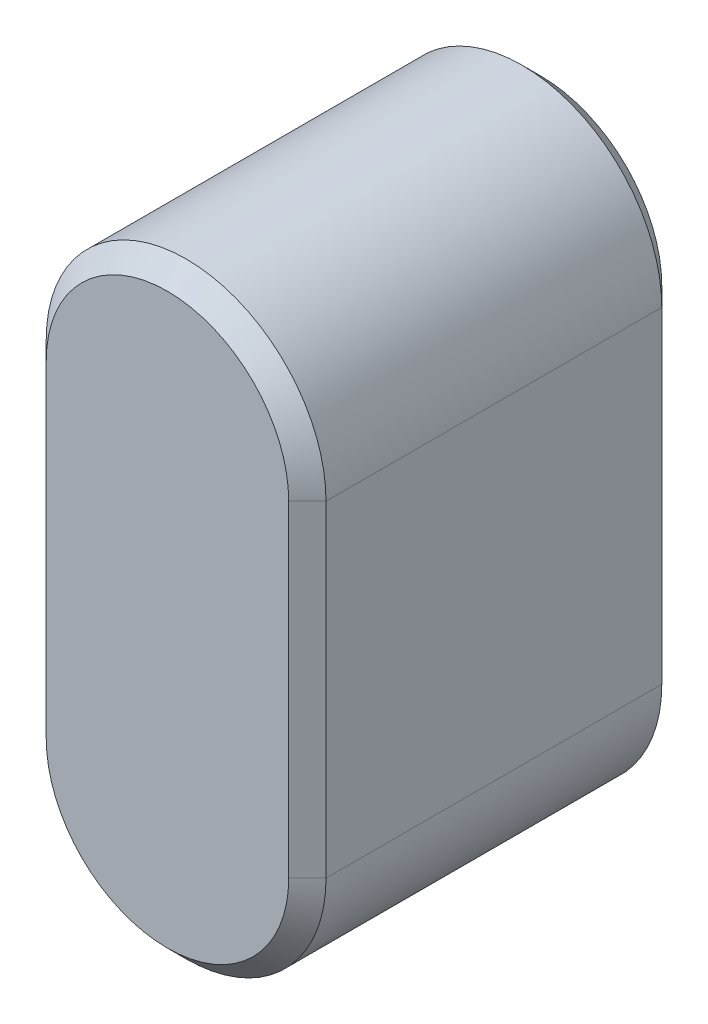
ISO-10303-21;
HEADER;
FILE_DESCRIPTION(('STEP AP214'),'2;1');
FILE_NAME('part.step','',(''),(''),'','','');
FILE_SCHEMA(('AUTOMOTIVE_DESIGN { 1 0 10303 214 1 1 1 1 }'));
ENDSEC;
DATA;
#1=APPLICATION_CONTEXT('core data for automotive mechanical design processes');
#2=APPLICATION_PROTOCOL_DEFINITION('international standard','automotive_design',2000,#1);
#3=PRODUCT_CONTEXT('',#1,'mechanical');
#4=PRODUCT('Part','Part','',(#3));
#5=PRODUCT_RELATED_PRODUCT_CATEGORY('part','',(#4));
#6=PRODUCT_DEFINITION_FORMATION('','',#4);
#7=PRODUCT_DEFINITION_CONTEXT('part definition',#1,'design');
#8=PRODUCT_DEFINITION('design','',#6,#7);
#9=PRODUCT_DEFINITION_SHAPE('','',#8);
#10=(LENGTH_UNIT() NAMED_UNIT(*) SI_UNIT(.MILLI.,.METRE.));
#11=(NAMED_UNIT(*) PLANE_ANGLE_UNIT() SI_UNIT($,.RADIAN.));
#12=(NAMED_UNIT(*) SI_UNIT($,.STERADIAN.) SOLID_ANGLE_UNIT());
#13=UNCERTAINTY_MEASURE_WITH_UNIT(LENGTH_MEASURE(1.E-05),#10,'distance_accuracy_value','');
#14=(GEOMETRIC_REPRESENTATION_CONTEXT(3) GLOBAL_UNCERTAINTY_ASSIGNED_CONTEXT((#13)) GLOBAL_UNIT_ASSIGNED_CONTEXT((#10,
#11,#12)) REPRESENTATION_CONTEXT('',''));
#15=CARTESIAN_POINT('',(0.,0.,0.));
#16=DIRECTION('',(0.,0.,1.));
#17=DIRECTION('',(1.,0.,0.));
#18=AXIS2_PLACEMENT_3D('',#15,#16,#17);
#19=CARTESIAN_POINT('',(0.,-1.75,4.));
#20=DIRECTION('',(0.,0.,-1.));
#21=DIRECTION('',(-1.,0.,0.));
#22=AXIS2_PLACEMENT_3D('',#19,#20,#21);
#23=CYLINDRICAL_SURFACE('',#22,1.5);
#24=DIRECTION('',(0.,0.,-1.));
#25=VECTOR('',#24,1.);
#26=CARTESIAN_POINT('',(-1.5,-1.75,4.));
#27=LINE('',#26,#25);
#28=CARTESIAN_POINT('',(-1.5,-1.75,3.8));
#29=VERTEX_POINT('',#28);
#30=CARTESIAN_POINT('',(-1.5,-1.75,0.200000000000001));
#31=VERTEX_POINT('',#30);
#32=EDGE_CURVE('E128',#29,#31,#27,.T.);
#33=ORIENTED_EDGE('',*,*,#32,.T.);
#34=CARTESIAN_POINT('',(0.,-1.75,0.200000000000001));
#35=DIRECTION('',(0.,0.,1.));
#36=DIRECTION('',(1.,0.,0.));
#37=AXIS2_PLACEMENT_3D('',#34,#35,#36);
#38=CIRCLE('',#37,1.5);
#39=CARTESIAN_POINT('',(1.5,-1.75,0.200000000000001));
#40=VERTEX_POINT('',#39);
#41=EDGE_CURVE('E130',#31,#40,#38,.T.);
#42=ORIENTED_EDGE('',*,*,#41,.T.);
#43=DIRECTION('',(0.,0.,-1.));
#44=VECTOR('',#43,1.);
#45=CARTESIAN_POINT('',(1.5,-1.75,4.));
#46=LINE('',#45,#44);
#47=CARTESIAN_POINT('',(1.5,-1.75,3.8));
#48=VERTEX_POINT('',#47);
#49=EDGE_CURVE('E123',#48,#40,#46,.T.);
#50=ORIENTED_EDGE('',*,*,#49,.F.);
#51=CARTESIAN_POINT('',(0.,-1.75,3.8));
#52=DIRECTION('',(0.,0.,1.));
#53=DIRECTION('',(1.,0.,0.));
#54=AXIS2_PLACEMENT_3D('',#51,#52,#53);
#55=CIRCLE('',#54,1.5);
#56=EDGE_CURVE('E110',#48,#29,#55,.F.);
#57=ORIENTED_EDGE('',*,*,#56,.T.);
#58=EDGE_LOOP('',(#33,#42,#50,#57));
#59=FACE_BOUND('',#58,.T.);
#60=ADVANCED_FACE('F39',(#59),#23,.T.);
#61=CARTESIAN_POINT('',(1.5,-1.75,4.));
#62=DIRECTION('',(-1.,0.,0.));
#63=DIRECTION('',(0.,-1.,0.));
#64=AXIS2_PLACEMENT_3D('',#61,#62,#63);
#65=PLANE('',#64);
#66=ORIENTED_EDGE('',*,*,#49,.T.);
#67=DIRECTION('',(0.,1.,0.));
#68=VECTOR('',#67,1.);
#69=CARTESIAN_POINT('',(1.5,-1.75,0.200000000000001));
#70=LINE('',#69,#68);
#71=CARTESIAN_POINT('',(1.5,1.75,0.200000000000001));
#72=VERTEX_POINT('',#71);
#73=EDGE_CURVE('E131',#40,#72,#70,.T.);
#74=ORIENTED_EDGE('',*,*,#73,.T.);
#75=DIRECTION('',(0.,0.,-1.));
#76=VECTOR('',#75,1.);
#77=CARTESIAN_POINT('',(1.5,1.75,4.));
#78=LINE('',#77,#76);
#79=CARTESIAN_POINT('',(1.5,1.75,3.8));
#80=VERTEX_POINT('',#79);
#81=EDGE_CURVE('E139',#80,#72,#78,.T.);
#82=ORIENTED_EDGE('',*,*,#81,.F.);
#83=DIRECTION('',(0.,-1.,0.));
#84=VECTOR('',#83,1.);
#85=CARTESIAN_POINT('',(1.5,-1.75,3.8));
#86=LINE('',#85,#84);
#87=EDGE_CURVE('E162',#80,#48,#86,.T.);
#88=ORIENTED_EDGE('',*,*,#87,.T.);
#89=EDGE_LOOP('',(#66,#74,#82,#88));
#90=FACE_BOUND('',#89,.T.);
#91=ADVANCED_FACE('F198',(#90),#65,.F.);
#92=CARTESIAN_POINT('',(0.,1.75,4.));
#93=DIRECTION('',(0.,0.,-1.));
#94=DIRECTION('',(-1.,0.,0.));
#95=AXIS2_PLACEMENT_3D('',#92,#93,#94);
#96=CYLINDRICAL_SURFACE('',#95,1.5);
#97=ORIENTED_EDGE('',*,*,#81,.T.);
#98=CARTESIAN_POINT('',(0.,1.75,0.200000000000001));
#99=DIRECTION('',(0.,0.,1.));
#100=DIRECTION('',(1.,0.,0.));
#101=AXIS2_PLACEMENT_3D('',#98,#99,#100);
#102=CIRCLE('',#101,1.5);
#103=CARTESIAN_POINT('',(-1.5,1.75,0.200000000000001));
#104=VERTEX_POINT('',#103);
#105=EDGE_CURVE('E160',#72,#104,#102,.T.);
#106=ORIENTED_EDGE('',*,*,#105,.T.);
#107=DIRECTION('',(0.,0.,-1.));
#108=VECTOR('',#107,1.);
#109=CARTESIAN_POINT('',(-1.5,1.75,4.));
#110=LINE('',#109,#108);
#111=CARTESIAN_POINT('',(-1.5,1.75,3.8));
#112=VERTEX_POINT('',#111);
#113=EDGE_CURVE('E136',#112,#104,#110,.T.);
#114=ORIENTED_EDGE('',*,*,#113,.F.);
#115=CARTESIAN_POINT('',(0.,1.75,3.8));
#116=DIRECTION('',(0.,0.,1.));
#117=DIRECTION('',(1.,0.,0.));
#118=AXIS2_PLACEMENT_3D('',#115,#116,#117);
#119=CIRCLE('',#118,1.5);
#120=EDGE_CURVE('E158',#112,#80,#119,.F.);
#121=ORIENTED_EDGE('',*,*,#120,.T.);
#122=EDGE_LOOP('',(#97,#106,#114,#121));
#123=FACE_BOUND('',#122,.T.);
#124=ADVANCED_FACE('F195',(#123),#96,.T.);
#125=CARTESIAN_POINT('',(-1.5,-1.75,4.));
#126=DIRECTION('',(1.,0.,0.));
#127=DIRECTION('',(0.,1.,0.));
#128=AXIS2_PLACEMENT_3D('',#125,#126,#127);
#129=PLANE('',#128);
#130=ORIENTED_EDGE('',*,*,#113,.T.);
#131=DIRECTION('',(0.,-1.,0.));
#132=VECTOR('',#131,1.);
#133=CARTESIAN_POINT('',(-1.5,-1.75,0.200000000000001));
#134=LINE('',#133,#132);
#135=EDGE_CURVE('E122',#104,#31,#134,.T.);
#136=ORIENTED_EDGE('',*,*,#135,.T.);
#137=ORIENTED_EDGE('',*,*,#32,.F.);
#138=DIRECTION('',(0.,1.,0.));
#139=VECTOR('',#138,1.);
#140=CARTESIAN_POINT('',(-1.5,1.75,3.8));
#141=LINE('',#140,#139);
#142=EDGE_CURVE('E115',#29,#112,#141,.T.);
#143=ORIENTED_EDGE('',*,*,#142,.T.);
#144=EDGE_LOOP('',(#130,#136,#137,#143));
#145=FACE_BOUND('',#144,.T.);
#146=ADVANCED_FACE('F134',(#145),#129,.F.);
#147=CARTESIAN_POINT('',(0.,-1.75,4.));
#148=DIRECTION('',(0.,0.,1.));
#149=DIRECTION('',(1.,0.,0.));
#150=AXIS2_PLACEMENT_3D('',#147,#148,#149);
#151=PLANE('',#150);
#152=DIRECTION('',(0.,-1.,0.));
#153=VECTOR('',#152,1.);
#154=CARTESIAN_POINT('',(-1.3,-1.75,4.));
#155=LINE('',#154,#153);
#156=CARTESIAN_POINT('',(-1.3,1.75,4.));
#157=VERTEX_POINT('',#156);
#158=CARTESIAN_POINT('',(-1.3,-1.75,4.));
#159=VERTEX_POINT('',#158);
#160=EDGE_CURVE('E64',#157,#159,#155,.T.);
#161=ORIENTED_EDGE('',*,*,#160,.T.);
#162=CARTESIAN_POINT('',(0.,-1.75,4.));
#163=DIRECTION('',(0.,0.,1.));
#164=DIRECTION('',(1.,0.,0.));
#165=AXIS2_PLACEMENT_3D('',#162,#163,#164);
#166=CIRCLE('',#165,1.3);
#167=CARTESIAN_POINT('',(1.3,-1.75,4.));
#168=VERTEX_POINT('',#167);
#169=EDGE_CURVE('E11',#159,#168,#166,.T.);
#170=ORIENTED_EDGE('',*,*,#169,.T.);
#171=DIRECTION('',(0.,1.,0.));
#172=VECTOR('',#171,1.);
#173=CARTESIAN_POINT('',(1.3,1.75,4.));
#174=LINE('',#173,#172);
#175=CARTESIAN_POINT('',(1.3,1.75,4.));
#176=VERTEX_POINT('',#175);
#177=EDGE_CURVE('E49',#168,#176,#174,.T.);
#178=ORIENTED_EDGE('',*,*,#177,.T.);
#179=CARTESIAN_POINT('',(0.,1.75,4.));
#180=DIRECTION('',(0.,0.,1.));
#181=DIRECTION('',(1.,0.,0.));
#182=AXIS2_PLACEMENT_3D('',#179,#180,#181);
#183=CIRCLE('',#182,1.3);
#184=EDGE_CURVE('E166',#176,#157,#183,.T.);
#185=ORIENTED_EDGE('',*,*,#184,.T.);
#186=EDGE_LOOP('',(#161,#170,#178,#185));
#187=FACE_BOUND('',#186,.T.);
#188=ADVANCED_FACE('F184',(#187),#151,.T.);
#189=CARTESIAN_POINT('',(0.,-1.75,0.));
#190=DIRECTION('',(0.,0.,1.));
#191=DIRECTION('',(1.,0.,0.));
#192=AXIS2_PLACEMENT_3D('',#189,#190,#191);
#193=PLANE('',#192);
#194=CARTESIAN_POINT('',(0.,-1.75,0.));
#195=DIRECTION('',(0.,0.,1.));
#196=DIRECTION('',(1.,0.,0.));
#197=AXIS2_PLACEMENT_3D('',#194,#195,#196);
#198=CIRCLE('',#197,1.3);
#199=CARTESIAN_POINT('',(1.3,-1.75,0.));
#200=VERTEX_POINT('',#199);
#201=CARTESIAN_POINT('',(-1.3,-1.75,0.));
#202=VERTEX_POINT('',#201);
#203=EDGE_CURVE('E149',#200,#202,#198,.F.);
#204=ORIENTED_EDGE('',*,*,#203,.T.);
#205=DIRECTION('',(0.,1.,0.));
#206=VECTOR('',#205,1.);
#207=CARTESIAN_POINT('',(-1.3,-1.75,0.));
#208=LINE('',#207,#206);
#209=CARTESIAN_POINT('',(-1.3,1.75,0.));
#210=VERTEX_POINT('',#209);
#211=EDGE_CURVE('E155',#202,#210,#208,.T.);
#212=ORIENTED_EDGE('',*,*,#211,.T.);
#213=CARTESIAN_POINT('',(0.,1.75,0.));
#214=DIRECTION('',(0.,0.,1.));
#215=DIRECTION('',(1.,0.,0.));
#216=AXIS2_PLACEMENT_3D('',#213,#214,#215);
#217=CIRCLE('',#216,1.3);
#218=CARTESIAN_POINT('',(1.3,1.75,0.));
#219=VERTEX_POINT('',#218);
#220=EDGE_CURVE('E153',#210,#219,#217,.F.);
#221=ORIENTED_EDGE('',*,*,#220,.T.);
#222=DIRECTION('',(0.,-1.,0.));
#223=VECTOR('',#222,1.);
#224=CARTESIAN_POINT('',(1.3,-1.75,0.));
#225=LINE('',#224,#223);
#226=EDGE_CURVE('E151',#219,#200,#225,.T.);
#227=ORIENTED_EDGE('',*,*,#226,.T.);
#228=EDGE_LOOP('',(#204,#212,#221,#227));
#229=FACE_BOUND('',#228,.T.);
#230=ADVANCED_FACE('F186',(#229),#193,.F.);
#231=CARTESIAN_POINT('',(1.5,-1.75,0.200000000000001));
#232=DIRECTION('',(-0.707106781186547,0.,0.707106781186548));
#233=DIRECTION('',(0.,1.,0.));
#234=AXIS2_PLACEMENT_3D('',#231,#232,#233);
#235=PLANE('',#234);
#236=DIRECTION('',(0.707106781186548,0.,0.707106781186547));
#237=VECTOR('',#236,1.);
#238=CARTESIAN_POINT('',(1.3,-1.75,0.));
#239=LINE('',#238,#237);
#240=EDGE_CURVE('E142',#200,#40,#239,.T.);
#241=ORIENTED_EDGE('',*,*,#240,.F.);
#242=ORIENTED_EDGE('',*,*,#226,.F.);
#243=DIRECTION('',(-0.707106781186548,0.,-0.707106781186547));
#244=VECTOR('',#243,1.);
#245=CARTESIAN_POINT('',(1.5,1.75,0.200000000000001));
#246=LINE('',#245,#244);
#247=EDGE_CURVE('E137',#72,#219,#246,.T.);
#248=ORIENTED_EDGE('',*,*,#247,.F.);
#249=ORIENTED_EDGE('',*,*,#73,.F.);
#250=EDGE_LOOP('',(#241,#242,#248,#249));
#251=FACE_BOUND('',#250,.T.);
#252=ADVANCED_FACE('F192',(#251),#235,.F.);
#253=CARTESIAN_POINT('',(0.,1.75,0.200000000000001));
#254=DIRECTION('',(0.,0.,1.));
#255=DIRECTION('',(1.,0.,0.));
#256=AXIS2_PLACEMENT_3D('',#253,#254,#255);
#257=CONICAL_SURFACE('',#256,1.5,0.785398163397449);
#258=ORIENTED_EDGE('',*,*,#247,.T.);
#259=ORIENTED_EDGE('',*,*,#220,.F.);
#260=DIRECTION('',(0.707106781186548,0.,-0.707106781186547));
#261=VECTOR('',#260,1.);
#262=CARTESIAN_POINT('',(-1.5,1.75,0.200000000000001));
#263=LINE('',#262,#261);
#264=EDGE_CURVE('E172',#104,#210,#263,.T.);
#265=ORIENTED_EDGE('',*,*,#264,.F.);
#266=ORIENTED_EDGE('',*,*,#105,.F.);
#267=EDGE_LOOP('',(#258,#259,#265,#266));
#268=FACE_BOUND('',#267,.T.);
#269=ADVANCED_FACE('F221',(#268),#257,.T.);
#270=CARTESIAN_POINT('',(0.,-1.75,0.200000000000001));
#271=DIRECTION('',(0.,0.,1.));
#272=DIRECTION('',(1.,0.,0.));
#273=AXIS2_PLACEMENT_3D('',#270,#271,#272);
#274=CONICAL_SURFACE('',#273,1.5,0.785398163397449);
#275=ORIENTED_EDGE('',*,*,#240,.T.);
#276=ORIENTED_EDGE('',*,*,#41,.F.);
#277=DIRECTION('',(-0.707106781186548,0.,0.707106781186547));
#278=VECTOR('',#277,1.);
#279=CARTESIAN_POINT('',(-1.3,-1.75,0.));
#280=LINE('',#279,#278);
#281=EDGE_CURVE('E170',#202,#31,#280,.T.);
#282=ORIENTED_EDGE('',*,*,#281,.F.);
#283=ORIENTED_EDGE('',*,*,#203,.F.);
#284=EDGE_LOOP('',(#275,#276,#282,#283));
#285=FACE_BOUND('',#284,.T.);
#286=ADVANCED_FACE('F214',(#285),#274,.T.);
#287=CARTESIAN_POINT('',(-1.5,-1.75,0.200000000000001));
#288=DIRECTION('',(0.707106781186547,0.,0.707106781186548));
#289=DIRECTION('',(0.,-1.,0.));
#290=AXIS2_PLACEMENT_3D('',#287,#288,#289);
#291=PLANE('',#290);
#292=ORIENTED_EDGE('',*,*,#264,.T.);
#293=ORIENTED_EDGE('',*,*,#211,.F.);
#294=ORIENTED_EDGE('',*,*,#281,.T.);
#295=ORIENTED_EDGE('',*,*,#135,.F.);
#296=EDGE_LOOP('',(#292,#293,#294,#295));
#297=FACE_BOUND('',#296,.T.);
#298=ADVANCED_FACE('F208',(#297),#291,.F.);
#299=CARTESIAN_POINT('',(0.,1.75,4.));
#300=DIRECTION('',(0.,0.,-1.));
#301=DIRECTION('',(-1.,0.,0.));
#302=AXIS2_PLACEMENT_3D('',#299,#300,#301);
#303=CONICAL_SURFACE('',#302,1.3,0.785398163397448);
#304=DIRECTION('',(-0.707106781186547,0.,0.707106781186547));
#305=VECTOR('',#304,1.);
#306=CARTESIAN_POINT('',(1.5,1.75,3.8));
#307=LINE('',#306,#305);
#308=EDGE_CURVE('E112',#80,#176,#307,.T.);
#309=ORIENTED_EDGE('',*,*,#308,.F.);
#310=ORIENTED_EDGE('',*,*,#120,.F.);
#311=DIRECTION('',(-0.707106781186547,0.,-0.707106781186547));
#312=VECTOR('',#311,1.);
#313=CARTESIAN_POINT('',(-1.3,1.75,4.));
#314=LINE('',#313,#312);
#315=EDGE_CURVE('E44',#157,#112,#314,.T.);
#316=ORIENTED_EDGE('',*,*,#315,.F.);
#317=ORIENTED_EDGE('',*,*,#184,.F.);
#318=EDGE_LOOP('',(#309,#310,#316,#317));
#319=FACE_BOUND('',#318,.T.);
#320=ADVANCED_FACE('F42',(#319),#303,.T.);
#321=CARTESIAN_POINT('',(-1.3,-1.75,4.));
#322=DIRECTION('',(-0.707106781186547,0.,0.707106781186547));
#323=DIRECTION('',(0.,1.,0.));
#324=AXIS2_PLACEMENT_3D('',#321,#322,#323);
#325=PLANE('',#324);
#326=ORIENTED_EDGE('',*,*,#315,.T.);
#327=ORIENTED_EDGE('',*,*,#142,.F.);
#328=DIRECTION('',(-0.707106781186547,0.,-0.707106781186547));
#329=VECTOR('',#328,1.);
#330=CARTESIAN_POINT('',(-1.3,-1.75,4.));
#331=LINE('',#330,#329);
#332=EDGE_CURVE('E106',#159,#29,#331,.T.);
#333=ORIENTED_EDGE('',*,*,#332,.F.);
#334=ORIENTED_EDGE('',*,*,#160,.F.);
#335=EDGE_LOOP('',(#326,#327,#333,#334));
#336=FACE_BOUND('',#335,.T.);
#337=ADVANCED_FACE('F116',(#336),#325,.T.);
#338=CARTESIAN_POINT('',(1.3,-1.75,4.));
#339=DIRECTION('',(0.707106781186547,0.,0.707106781186547));
#340=DIRECTION('',(0.,-1.,0.));
#341=AXIS2_PLACEMENT_3D('',#338,#339,#340);
#342=PLANE('',#341);
#343=ORIENTED_EDGE('',*,*,#308,.T.);
#344=ORIENTED_EDGE('',*,*,#177,.F.);
#345=DIRECTION('',(-0.707106781186547,0.,0.707106781186547));
#346=VECTOR('',#345,1.);
#347=CARTESIAN_POINT('',(1.5,-1.75,3.8));
#348=LINE('',#347,#346);
#349=EDGE_CURVE('E57',#48,#168,#348,.T.);
#350=ORIENTED_EDGE('',*,*,#349,.F.);
#351=ORIENTED_EDGE('',*,*,#87,.F.);
#352=EDGE_LOOP('',(#343,#344,#350,#351));
#353=FACE_BOUND('',#352,.T.);
#354=ADVANCED_FACE('F180',(#353),#342,.T.);
#355=CARTESIAN_POINT('',(0.,-1.75,4.));
#356=DIRECTION('',(0.,0.,-1.));
#357=DIRECTION('',(-1.,0.,0.));
#358=AXIS2_PLACEMENT_3D('',#355,#356,#357);
#359=CONICAL_SURFACE('',#358,1.3,0.785398163397448);
#360=ORIENTED_EDGE('',*,*,#332,.T.);
#361=ORIENTED_EDGE('',*,*,#56,.F.);
#362=ORIENTED_EDGE('',*,*,#349,.T.);
#363=ORIENTED_EDGE('',*,*,#169,.F.);
#364=EDGE_LOOP('',(#360,#361,#362,#363));
#365=FACE_BOUND('',#364,.T.);
#366=ADVANCED_FACE('F108',(#365),#359,.T.);
#367=CLOSED_SHELL('',(#60,#91,#124,#146,#188,#230,#252,#269,#286,#298,#320,#337,#354,#366));
#368=MANIFOLD_SOLID_BREP('B2',#367);
#369=ADVANCED_BREP_SHAPE_REPRESENTATION('',(#18,#368),#14);
#370=SHAPE_DEFINITION_REPRESENTATION(#9,#369);
ENDSEC;
END-ISO-10303-21;
